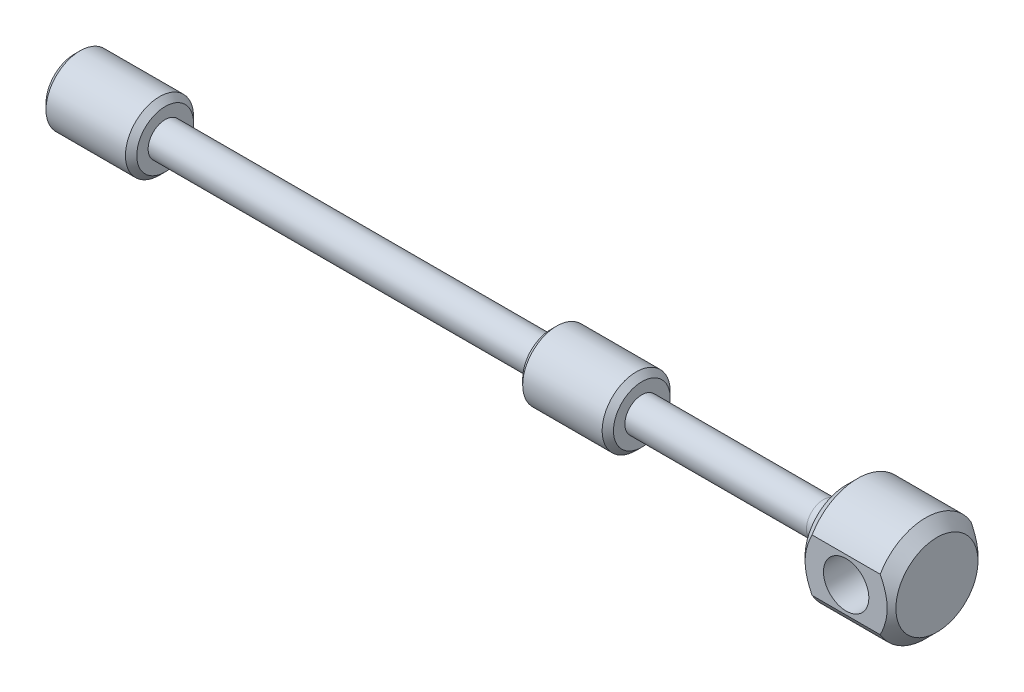
ISO-10303-21;
HEADER;
FILE_DESCRIPTION(('STEP AP214'),'2;1');
FILE_NAME('part.step','',(''),(''),'','','');
FILE_SCHEMA(('AUTOMOTIVE_DESIGN { 1 0 10303 214 1 1 1 1 }'));
ENDSEC;
DATA;
#1=APPLICATION_CONTEXT('core data for automotive mechanical design processes');
#2=APPLICATION_PROTOCOL_DEFINITION('international standard','automotive_design',2000,#1);
#3=PRODUCT_CONTEXT('',#1,'mechanical');
#4=PRODUCT('Part','Part','',(#3));
#5=PRODUCT_RELATED_PRODUCT_CATEGORY('part','',(#4));
#6=PRODUCT_DEFINITION_FORMATION('','',#4);
#7=PRODUCT_DEFINITION_CONTEXT('part definition',#1,'design');
#8=PRODUCT_DEFINITION('design','',#6,#7);
#9=PRODUCT_DEFINITION_SHAPE('','',#8);
#10=(LENGTH_UNIT() NAMED_UNIT(*) SI_UNIT(.MILLI.,.METRE.));
#11=(NAMED_UNIT(*) PLANE_ANGLE_UNIT() SI_UNIT($,.RADIAN.));
#12=(NAMED_UNIT(*) SI_UNIT($,.STERADIAN.) SOLID_ANGLE_UNIT());
#13=UNCERTAINTY_MEASURE_WITH_UNIT(LENGTH_MEASURE(1.E-05),#10,'distance_accuracy_value','');
#14=(GEOMETRIC_REPRESENTATION_CONTEXT(3) GLOBAL_UNCERTAINTY_ASSIGNED_CONTEXT((#13)) GLOBAL_UNIT_ASSIGNED_CONTEXT((#10,
#11,#12)) REPRESENTATION_CONTEXT('',''));
#15=CARTESIAN_POINT('',(0.,0.,0.));
#16=DIRECTION('',(0.,0.,1.));
#17=DIRECTION('',(1.,0.,0.));
#18=AXIS2_PLACEMENT_3D('',#15,#16,#17);
#19=CARTESIAN_POINT('',(30.,0.,0.));
#20=DIRECTION('',(1.,0.,0.));
#21=DIRECTION('',(0.,0.,-1.));
#22=AXIS2_PLACEMENT_3D('',#19,#20,#21);
#23=CYLINDRICAL_SURFACE('',#22,4.61737045275685);
#24=DIRECTION('',(1.,0.,0.));
#25=VECTOR('',#24,1.);
#26=CARTESIAN_POINT('',(30.,-2.30653634222225,4.));
#27=LINE('',#26,#25);
#28=CARTESIAN_POINT('',(31.,-2.30653634222225,4.));
#29=VERTEX_POINT('',#28);
#30=CARTESIAN_POINT('',(37.,-2.30653634222225,4.));
#31=VERTEX_POINT('',#30);
#32=EDGE_CURVE('E98',#29,#31,#27,.T.);
#33=ORIENTED_EDGE('',*,*,#32,.F.);
#34=CARTESIAN_POINT('',(31.,0.,0.));
#35=DIRECTION('',(1.,0.,0.));
#36=DIRECTION('',(0.,0.,-1.));
#37=AXIS2_PLACEMENT_3D('',#34,#35,#36);
#38=CIRCLE('',#37,4.61737045275685);
#39=CARTESIAN_POINT('',(31.,-2.30653634222225,-4.));
#40=VERTEX_POINT('',#39);
#41=EDGE_CURVE('E82',#29,#40,#38,.T.);
#42=ORIENTED_EDGE('',*,*,#41,.T.);
#43=DIRECTION('',(1.,0.,0.));
#44=VECTOR('',#43,1.);
#45=CARTESIAN_POINT('',(30.,-2.30653634222225,-4.));
#46=LINE('',#45,#44);
#47=CARTESIAN_POINT('',(37.,-2.30653634222225,-4.));
#48=VERTEX_POINT('',#47);
#49=EDGE_CURVE('E95',#40,#48,#46,.T.);
#50=ORIENTED_EDGE('',*,*,#49,.T.);
#51=CARTESIAN_POINT('',(37.,0.,0.));
#52=DIRECTION('',(1.,0.,0.));
#53=DIRECTION('',(0.,0.,-1.));
#54=AXIS2_PLACEMENT_3D('',#51,#52,#53);
#55=CIRCLE('',#54,4.61737045275685);
#56=EDGE_CURVE('E99',#48,#31,#55,.F.);
#57=ORIENTED_EDGE('',*,*,#56,.T.);
#58=EDGE_LOOP('',(#33,#42,#50,#57));
#59=FACE_BOUND('',#58,.T.);
#60=ADVANCED_FACE('F33',(#59),#23,.T.);
#61=CARTESIAN_POINT('',(38.,0.,0.));
#62=DIRECTION('',(-1.,0.,0.));
#63=DIRECTION('',(0.,0.,1.));
#64=AXIS2_PLACEMENT_3D('',#61,#62,#63);
#65=CYLINDRICAL_SURFACE('',#64,1.5);
#66=CARTESIAN_POINT('',(28.,0.,0.));
#67=DIRECTION('',(1.,0.,0.));
#68=DIRECTION('',(0.,0.,-1.));
#69=AXIS2_PLACEMENT_3D('',#66,#67,#68);
#70=CIRCLE('',#69,1.5);
#71=CARTESIAN_POINT('',(28.,0.,-1.5));
#72=VERTEX_POINT('',#71);
#73=EDGE_CURVE('E11',#72,#72,#70,.F.);
#74=ORIENTED_EDGE('',*,*,#73,.T.);
#75=EDGE_LOOP('',(#74));
#76=FACE_BOUND('',#75,.T.);
#77=CARTESIAN_POINT('',(12.,0.,0.));
#78=DIRECTION('',(-1.,0.,0.));
#79=DIRECTION('',(0.,0.,1.));
#80=AXIS2_PLACEMENT_3D('',#77,#78,#79);
#81=CIRCLE('',#80,1.5);
#82=CARTESIAN_POINT('',(12.,0.,1.5));
#83=VERTEX_POINT('',#82);
#84=EDGE_CURVE('E119',#83,#83,#81,.T.);
#85=ORIENTED_EDGE('',*,*,#84,.F.);
#86=EDGE_LOOP('',(#85));
#87=FACE_BOUND('',#86,.T.);
#88=ADVANCED_FACE('F215',(#76,#87),#65,.T.);
#89=CARTESIAN_POINT('',(4.,0.,0.));
#90=DIRECTION('',(-1.,0.,0.));
#91=DIRECTION('',(0.,0.,1.));
#92=AXIS2_PLACEMENT_3D('',#89,#90,#91);
#93=CIRCLE('',#92,1.5);
#94=CARTESIAN_POINT('',(4.,0.,1.5));
#95=VERTEX_POINT('',#94);
#96=EDGE_CURVE('E114',#95,#95,#93,.T.);
#97=ORIENTED_EDGE('',*,*,#96,.T.);
#98=EDGE_LOOP('',(#97));
#99=FACE_BOUND('',#98,.T.);
#100=CARTESIAN_POINT('',(-30.,0.,0.));
#101=DIRECTION('',(-1.,0.,0.));
#102=DIRECTION('',(0.,0.,1.));
#103=AXIS2_PLACEMENT_3D('',#100,#101,#102);
#104=CIRCLE('',#103,1.5);
#105=CARTESIAN_POINT('',(-30.,0.,1.5));
#106=VERTEX_POINT('',#105);
#107=EDGE_CURVE('E116',#106,#106,#104,.T.);
#108=ORIENTED_EDGE('',*,*,#107,.F.);
#109=EDGE_LOOP('',(#108));
#110=FACE_BOUND('',#109,.T.);
#111=ADVANCED_FACE('F211',(#99,#110),#65,.T.);
#112=CARTESIAN_POINT('',(-30.,0.,0.));
#113=DIRECTION('',(-1.,0.,0.));
#114=DIRECTION('',(0.,0.,1.));
#115=AXIS2_PLACEMENT_3D('',#112,#113,#114);
#116=CYLINDRICAL_SURFACE('',#115,3.);
#117=CARTESIAN_POINT('',(-37.5,0.,0.));
#118=DIRECTION('',(1.,0.,0.));
#119=DIRECTION('',(0.,0.,-1.));
#120=AXIS2_PLACEMENT_3D('',#117,#118,#119);
#121=CIRCLE('',#120,3.);
#122=CARTESIAN_POINT('',(-37.5,0.,-3.));
#123=VERTEX_POINT('',#122);
#124=EDGE_CURVE('E142',#123,#123,#121,.T.);
#125=ORIENTED_EDGE('',*,*,#124,.T.);
#126=EDGE_LOOP('',(#125));
#127=FACE_BOUND('',#126,.T.);
#128=CARTESIAN_POINT('',(-30.5,0.,0.));
#129=DIRECTION('',(-1.,0.,0.));
#130=DIRECTION('',(0.,0.,1.));
#131=AXIS2_PLACEMENT_3D('',#128,#129,#130);
#132=CIRCLE('',#131,3.);
#133=CARTESIAN_POINT('',(-30.5,0.,3.));
#134=VERTEX_POINT('',#133);
#135=EDGE_CURVE('E139',#134,#134,#132,.T.);
#136=ORIENTED_EDGE('',*,*,#135,.T.);
#137=EDGE_LOOP('',(#136));
#138=FACE_BOUND('',#137,.T.);
#139=ADVANCED_FACE('F214',(#127,#138),#116,.T.);
#140=CARTESIAN_POINT('',(-30.,0.,0.));
#141=DIRECTION('',(-1.,0.,0.));
#142=DIRECTION('',(0.,0.,1.));
#143=AXIS2_PLACEMENT_3D('',#140,#141,#142);
#144=PLANE('',#143);
#145=CARTESIAN_POINT('',(-30.,0.,0.));
#146=DIRECTION('',(-1.,0.,0.));
#147=DIRECTION('',(0.,0.,1.));
#148=AXIS2_PLACEMENT_3D('',#145,#146,#147);
#149=CIRCLE('',#148,2.5);
#150=CARTESIAN_POINT('',(-30.,0.,2.5));
#151=VERTEX_POINT('',#150);
#152=EDGE_CURVE('E145',#151,#151,#149,.F.);
#153=ORIENTED_EDGE('',*,*,#152,.T.);
#154=EDGE_LOOP('',(#153));
#155=FACE_BOUND('',#154,.T.);
#156=ORIENTED_EDGE('',*,*,#107,.T.);
#157=EDGE_LOOP('',(#156));
#158=FACE_BOUND('',#157,.T.);
#159=ADVANCED_FACE('F221',(#155,#158),#144,.F.);
#160=CARTESIAN_POINT('',(-38.,0.,0.));
#161=DIRECTION('',(1.,0.,0.));
#162=DIRECTION('',(0.,0.,-1.));
#163=AXIS2_PLACEMENT_3D('',#160,#161,#162);
#164=PLANE('',#163);
#165=CARTESIAN_POINT('',(-38.,0.,0.));
#166=DIRECTION('',(1.,0.,0.));
#167=DIRECTION('',(0.,0.,-1.));
#168=AXIS2_PLACEMENT_3D('',#165,#166,#167);
#169=CIRCLE('',#168,2.5);
#170=CARTESIAN_POINT('',(-38.,0.,-2.5));
#171=VERTEX_POINT('',#170);
#172=EDGE_CURVE('E136',#171,#171,#169,.F.);
#173=ORIENTED_EDGE('',*,*,#172,.T.);
#174=EDGE_LOOP('',(#173));
#175=FACE_BOUND('',#174,.T.);
#176=ADVANCED_FACE('F217',(#175),#164,.F.);
#177=CARTESIAN_POINT('',(4.,0.,0.));
#178=DIRECTION('',(1.,0.,0.));
#179=DIRECTION('',(0.,0.,-1.));
#180=AXIS2_PLACEMENT_3D('',#177,#178,#179);
#181=CYLINDRICAL_SURFACE('',#180,3.);
#182=CARTESIAN_POINT('',(11.5,0.,0.));
#183=DIRECTION('',(-1.,0.,0.));
#184=DIRECTION('',(0.,0.,1.));
#185=AXIS2_PLACEMENT_3D('',#182,#183,#184);
#186=CIRCLE('',#185,3.);
#187=CARTESIAN_POINT('',(11.5,0.,3.));
#188=VERTEX_POINT('',#187);
#189=EDGE_CURVE('E127',#188,#188,#186,.T.);
#190=ORIENTED_EDGE('',*,*,#189,.T.);
#191=EDGE_LOOP('',(#190));
#192=FACE_BOUND('',#191,.T.);
#193=CARTESIAN_POINT('',(4.50000000000001,0.,0.));
#194=DIRECTION('',(-1.,0.,0.));
#195=DIRECTION('',(0.,0.,1.));
#196=AXIS2_PLACEMENT_3D('',#193,#194,#195);
#197=CIRCLE('',#196,3.);
#198=CARTESIAN_POINT('',(4.50000000000001,0.,3.));
#199=VERTEX_POINT('',#198);
#200=EDGE_CURVE('E122',#199,#199,#197,.F.);
#201=ORIENTED_EDGE('',*,*,#200,.T.);
#202=EDGE_LOOP('',(#201));
#203=FACE_BOUND('',#202,.T.);
#204=ADVANCED_FACE('F220',(#192,#203),#181,.T.);
#205=CARTESIAN_POINT('',(4.,0.,0.));
#206=DIRECTION('',(-1.,0.,0.));
#207=DIRECTION('',(0.,0.,1.));
#208=AXIS2_PLACEMENT_3D('',#205,#206,#207);
#209=PLANE('',#208);
#210=CARTESIAN_POINT('',(4.,0.,0.));
#211=DIRECTION('',(-1.,0.,0.));
#212=DIRECTION('',(0.,0.,1.));
#213=AXIS2_PLACEMENT_3D('',#210,#211,#212);
#214=CIRCLE('',#213,2.5);
#215=CARTESIAN_POINT('',(4.,0.,2.5));
#216=VERTEX_POINT('',#215);
#217=EDGE_CURVE('E133',#216,#216,#214,.T.);
#218=ORIENTED_EDGE('',*,*,#217,.T.);
#219=EDGE_LOOP('',(#218));
#220=FACE_BOUND('',#219,.T.);
#221=ORIENTED_EDGE('',*,*,#96,.F.);
#222=EDGE_LOOP('',(#221));
#223=FACE_BOUND('',#222,.T.);
#224=ADVANCED_FACE('F234',(#220,#223),#209,.T.);
#225=CARTESIAN_POINT('',(12.,0.,0.));
#226=DIRECTION('',(-1.,0.,0.));
#227=DIRECTION('',(0.,0.,1.));
#228=AXIS2_PLACEMENT_3D('',#225,#226,#227);
#229=PLANE('',#228);
#230=CARTESIAN_POINT('',(12.,0.,0.));
#231=DIRECTION('',(-1.,0.,0.));
#232=DIRECTION('',(0.,0.,1.));
#233=AXIS2_PLACEMENT_3D('',#230,#231,#232);
#234=CIRCLE('',#233,2.50000000000001);
#235=CARTESIAN_POINT('',(12.,0.,2.50000000000001));
#236=VERTEX_POINT('',#235);
#237=EDGE_CURVE('E130',#236,#236,#234,.F.);
#238=ORIENTED_EDGE('',*,*,#237,.T.);
#239=EDGE_LOOP('',(#238));
#240=FACE_BOUND('',#239,.T.);
#241=ORIENTED_EDGE('',*,*,#84,.T.);
#242=EDGE_LOOP('',(#241));
#243=FACE_BOUND('',#242,.T.);
#244=ADVANCED_FACE('F209',(#240,#243),#229,.F.);
#245=CARTESIAN_POINT('',(11.5,0.,0.));
#246=DIRECTION('',(-1.,0.,0.));
#247=DIRECTION('',(0.,0.,1.));
#248=AXIS2_PLACEMENT_3D('',#245,#246,#247);
#249=CONICAL_SURFACE('',#248,3.,0.785398163397453);
#250=ORIENTED_EDGE('',*,*,#237,.F.);
#251=EDGE_LOOP('',(#250));
#252=FACE_BOUND('',#251,.T.);
#253=ORIENTED_EDGE('',*,*,#189,.F.);
#254=EDGE_LOOP('',(#253));
#255=FACE_BOUND('',#254,.T.);
#256=ADVANCED_FACE('F205',(#252,#255),#249,.T.);
#257=CARTESIAN_POINT('',(4.,0.,0.));
#258=DIRECTION('',(1.,0.,0.));
#259=DIRECTION('',(0.,0.,-1.));
#260=AXIS2_PLACEMENT_3D('',#257,#258,#259);
#261=CONICAL_SURFACE('',#260,2.5,0.785398163397444);
#262=ORIENTED_EDGE('',*,*,#200,.F.);
#263=EDGE_LOOP('',(#262));
#264=FACE_BOUND('',#263,.T.);
#265=ORIENTED_EDGE('',*,*,#217,.F.);
#266=EDGE_LOOP('',(#265));
#267=FACE_BOUND('',#266,.T.);
#268=ADVANCED_FACE('F201',(#264,#267),#261,.T.);
#269=CARTESIAN_POINT('',(-38.,0.,0.));
#270=DIRECTION('',(1.,0.,0.));
#271=DIRECTION('',(0.,0.,-1.));
#272=AXIS2_PLACEMENT_3D('',#269,#270,#271);
#273=CONICAL_SURFACE('',#272,2.5,0.785398163397446);
#274=ORIENTED_EDGE('',*,*,#124,.F.);
#275=EDGE_LOOP('',(#274));
#276=FACE_BOUND('',#275,.T.);
#277=ORIENTED_EDGE('',*,*,#172,.F.);
#278=EDGE_LOOP('',(#277));
#279=FACE_BOUND('',#278,.T.);
#280=ADVANCED_FACE('F197',(#276,#279),#273,.T.);
#281=CARTESIAN_POINT('',(-30.5,0.,0.));
#282=DIRECTION('',(-1.,0.,0.));
#283=DIRECTION('',(0.,0.,1.));
#284=AXIS2_PLACEMENT_3D('',#281,#282,#283);
#285=CONICAL_SURFACE('',#284,3.,0.785398163397453);
#286=ORIENTED_EDGE('',*,*,#152,.F.);
#287=EDGE_LOOP('',(#286));
#288=FACE_BOUND('',#287,.T.);
#289=ORIENTED_EDGE('',*,*,#135,.F.);
#290=EDGE_LOOP('',(#289));
#291=FACE_BOUND('',#290,.T.);
#292=ADVANCED_FACE('F192',(#288,#291),#285,.T.);
#293=DIRECTION('',(1.,0.,0.));
#294=VECTOR('',#293,1.);
#295=CARTESIAN_POINT('',(30.,2.30653634222225,-4.));
#296=LINE('',#295,#294);
#297=CARTESIAN_POINT('',(31.,2.30653634222225,-4.));
#298=VERTEX_POINT('',#297);
#299=CARTESIAN_POINT('',(37.,2.30653634222225,-4.));
#300=VERTEX_POINT('',#299);
#301=EDGE_CURVE('E103',#298,#300,#296,.T.);
#302=ORIENTED_EDGE('',*,*,#301,.F.);
#303=CARTESIAN_POINT('',(31.,0.,0.));
#304=DIRECTION('',(1.,0.,0.));
#305=DIRECTION('',(0.,0.,-1.));
#306=AXIS2_PLACEMENT_3D('',#303,#304,#305);
#307=CIRCLE('',#306,4.61737045275685);
#308=CARTESIAN_POINT('',(31.,2.30653634222225,4.));
#309=VERTEX_POINT('',#308);
#310=EDGE_CURVE('E83',#298,#309,#307,.T.);
#311=ORIENTED_EDGE('',*,*,#310,.T.);
#312=DIRECTION('',(1.,0.,0.));
#313=VECTOR('',#312,1.);
#314=CARTESIAN_POINT('',(30.,2.30653634222225,4.));
#315=LINE('',#314,#313);
#316=CARTESIAN_POINT('',(37.,2.30653634222225,4.));
#317=VERTEX_POINT('',#316);
#318=EDGE_CURVE('E105',#309,#317,#315,.T.);
#319=ORIENTED_EDGE('',*,*,#318,.T.);
#320=CARTESIAN_POINT('',(37.,0.,0.));
#321=DIRECTION('',(-1.,0.,0.));
#322=DIRECTION('',(0.,0.,1.));
#323=AXIS2_PLACEMENT_3D('',#320,#321,#322);
#324=CIRCLE('',#323,4.61737045275685);
#325=EDGE_CURVE('E88',#317,#300,#324,.T.);
#326=ORIENTED_EDGE('',*,*,#325,.T.);
#327=EDGE_LOOP('',(#302,#311,#319,#326));
#328=FACE_BOUND('',#327,.T.);
#329=ADVANCED_FACE('F196',(#328),#23,.T.);
#330=CARTESIAN_POINT('',(30.,0.,0.));
#331=DIRECTION('',(1.,0.,0.));
#332=DIRECTION('',(0.,0.,-1.));
#333=AXIS2_PLACEMENT_3D('',#330,#331,#332);
#334=PLANE('',#333);
#335=CARTESIAN_POINT('',(30.,0.,0.));
#336=DIRECTION('',(1.,0.,0.));
#337=DIRECTION('',(0.,0.,-1.));
#338=AXIS2_PLACEMENT_3D('',#335,#336,#337);
#339=CIRCLE('',#338,3.5);
#340=CARTESIAN_POINT('',(30.,0.,-3.5));
#341=VERTEX_POINT('',#340);
#342=EDGE_CURVE('E41',#341,#341,#339,.T.);
#343=ORIENTED_EDGE('',*,*,#342,.T.);
#344=EDGE_LOOP('',(#343));
#345=FACE_BOUND('',#344,.T.);
#346=CARTESIAN_POINT('',(30.,0.,0.));
#347=DIRECTION('',(1.,0.,0.));
#348=DIRECTION('',(0.,0.,-1.));
#349=AXIS2_PLACEMENT_3D('',#346,#347,#348);
#350=CIRCLE('',#349,3.61737045275683);
#351=CARTESIAN_POINT('',(30.,-1.80700173354792,3.13370606908704));
#352=VERTEX_POINT('',#351);
#353=EDGE_CURVE('E51',#352,#352,#350,.F.);
#354=ORIENTED_EDGE('',*,*,#353,.T.);
#355=EDGE_LOOP('',(#354));
#356=FACE_BOUND('',#355,.T.);
#357=ADVANCED_FACE('F173',(#345,#356),#334,.F.);
#358=CARTESIAN_POINT('',(38.,0.,0.));
#359=DIRECTION('',(1.,0.,0.));
#360=DIRECTION('',(0.,0.,-1.));
#361=AXIS2_PLACEMENT_3D('',#358,#359,#360);
#362=PLANE('',#361);
#363=CARTESIAN_POINT('',(38.,0.,0.));
#364=DIRECTION('',(1.,0.,0.));
#365=DIRECTION('',(0.,0.,-1.));
#366=AXIS2_PLACEMENT_3D('',#363,#364,#365);
#367=CIRCLE('',#366,3.61737045275685);
#368=CARTESIAN_POINT('',(38.,-1.80700173354794,3.13370606908706));
#369=VERTEX_POINT('',#368);
#370=EDGE_CURVE('E46',#369,#369,#367,.T.);
#371=ORIENTED_EDGE('',*,*,#370,.T.);
#372=EDGE_LOOP('',(#371));
#373=FACE_BOUND('',#372,.T.);
#374=ADVANCED_FACE('F171',(#373),#362,.T.);
#375=CARTESIAN_POINT('',(30.,2.30653634222225,4.));
#376=DIRECTION('',(0.,0.,-1.));
#377=DIRECTION('',(-1.,0.,0.));
#378=AXIS2_PLACEMENT_3D('',#375,#376,#377);
#379=PLANE('',#378);
#380=CARTESIAN_POINT('',(34.,0.,4.));
#381=DIRECTION('',(0.,0.,1.));
#382=DIRECTION('',(1.,0.,0.));
#383=AXIS2_PLACEMENT_3D('',#380,#381,#382);
#384=CIRCLE('',#383,2.);
#385=CARTESIAN_POINT('',(36.,0.,4.));
#386=VERTEX_POINT('',#385);
#387=EDGE_CURVE('E110',#386,#386,#384,.T.);
#388=ORIENTED_EDGE('',*,*,#387,.F.);
#389=EDGE_LOOP('',(#388));
#390=FACE_BOUND('',#389,.T.);
#391=ORIENTED_EDGE('',*,*,#318,.F.);
#392=CARTESIAN_POINT('',(31.,2.30653634222225,4.));
#393=CARTESIAN_POINT('',(30.9601974597438,2.22684266093385,4.));
#394=CARTESIAN_POINT('',(30.9216231431797,2.14653696816026,4.));
#395=CARTESIAN_POINT('',(30.8473064089955,1.98457447196258,4.));
#396=CARTESIAN_POINT('',(30.8115655703819,1.9029169454187,4.));
#397=CARTESIAN_POINT('',(30.7088575437757,1.65498056887095,4.));
#398=CARTESIAN_POINT('',(30.6468383548584,1.48658671679935,4.));
#399=CARTESIAN_POINT('',(30.5412607989887,1.14860833810381,4.));
#400=CARTESIAN_POINT('',(30.4972814479607,0.979157717006152,4.));
#401=CARTESIAN_POINT('',(30.4295038036427,0.636549566748635,4.));
#402=CARTESIAN_POINT('',(30.4056556592604,0.46340228944076,4.));
#403=CARTESIAN_POINT('',(30.3840669183017,0.164574112776573,4.));
#404=CARTESIAN_POINT('',(30.3808617336459,0.0392721423522474,4.));
#405=CARTESIAN_POINT('',(30.3862430683893,-0.211128815166595,4.));
#406=CARTESIAN_POINT('',(30.3948336776276,-0.336227716794167,4.));
#407=CARTESIAN_POINT('',(30.4233923902341,-0.58587740230277,4.));
#408=CARTESIAN_POINT('',(30.4434302000968,-0.710420072627269,4.));
#409=CARTESIAN_POINT('',(30.4938204507105,-0.957346696288617,4.));
#410=CARTESIAN_POINT('',(30.5241717494015,-1.07973088706612,4.));
#411=CARTESIAN_POINT('',(30.6126932465116,-1.38760538730253,4.));
#412=CARTESIAN_POINT('',(30.677023282784,-1.57132135717105,4.));
#413=CARTESIAN_POINT('',(30.8218782374388,-1.9324637971529,4.));
#414=CARTESIAN_POINT('',(30.9024340363439,-2.10987750387023,4.));
#415=CARTESIAN_POINT('',(31.0747286228758,-2.45730641506917,4.));
#416=CARTESIAN_POINT('',(31.1663702829186,-2.62737036174245,4.));
#417=CARTESIAN_POINT('',(31.3100988256545,-2.87829920478718,4.));
#418=CARTESIAN_POINT('',(31.3589325667636,-2.96106101409465,4.));
#419=CARTESIAN_POINT('',(31.4584593076874,-3.12543004683318,4.));
#420=CARTESIAN_POINT('',(31.5091518061041,-3.20703757351878,4.));
#421=CARTESIAN_POINT('',(31.5606453298821,-3.28813738235769,4.));
#422=B_SPLINE_CURVE_WITH_KNOTS('',3,(#392,#393,#394,#395,#396,#397,#398,#399,#400,#401,#402,
#403,#404,#405,#406,#407,#408,#409,#410,#411,#412,#413,#414,#415,#416,#417,#418,#419,#420,#421),
.UNSPECIFIED.,.F.,.F.,(4,2,2,2,2,2,2,2,2,2,2,2,2,2,4),(0.,0.267220652181242,0.534589186154761,
1.07217853167009,1.59639022074266,2.11929995944174,2.49480039424982,2.87043105549436,
3.24837383892696,3.62627478464406,4.20913804617866,4.79312126389391,5.37231532862606,
5.66058208284876,5.94877164134548),.UNSPECIFIED.);
#423=EDGE_CURVE('E183',#309,#29,#422,.T.);
#424=ORIENTED_EDGE('',*,*,#423,.T.);
#425=ORIENTED_EDGE('',*,*,#32,.T.);
#426=CARTESIAN_POINT('',(37.,-2.30653634222225,4.));
#427=CARTESIAN_POINT('',(37.0398025402563,-2.22684266093386,4.));
#428=CARTESIAN_POINT('',(37.0783768568203,-2.14653696816026,4.));
#429=CARTESIAN_POINT('',(37.1526935910045,-1.98457447196258,4.));
#430=CARTESIAN_POINT('',(37.1884344296181,-1.90291694541871,4.));
#431=CARTESIAN_POINT('',(37.2911424562243,-1.65498056887096,4.));
#432=CARTESIAN_POINT('',(37.3531616451416,-1.48658671679936,4.));
#433=CARTESIAN_POINT('',(37.4587392010113,-1.14860833810381,4.));
#434=CARTESIAN_POINT('',(37.5027185520393,-0.979157717006157,4.));
#435=CARTESIAN_POINT('',(37.5704961963573,-0.63654956674864,4.));
#436=CARTESIAN_POINT('',(37.5943443407397,-0.463402289440766,4.));
#437=CARTESIAN_POINT('',(37.6159330816983,-0.164574112776578,4.));
#438=CARTESIAN_POINT('',(37.6191382663542,-0.0392721423522532,4.));
#439=CARTESIAN_POINT('',(37.6137569316108,0.211128815166589,4.));
#440=CARTESIAN_POINT('',(37.6051663223725,0.336227716794161,4.));
#441=CARTESIAN_POINT('',(37.5766076097659,0.585877402302764,4.));
#442=CARTESIAN_POINT('',(37.5565697999032,0.710420072627263,4.));
#443=CARTESIAN_POINT('',(37.5061795492895,0.957346696288611,4.));
#444=CARTESIAN_POINT('',(37.4758282505986,1.07973088706612,4.));
#445=CARTESIAN_POINT('',(37.3873067534884,1.38760538730252,4.));
#446=CARTESIAN_POINT('',(37.322976717216,1.57132135717104,4.));
#447=CARTESIAN_POINT('',(37.1781217625613,1.93246379715289,4.));
#448=CARTESIAN_POINT('',(37.0975659636562,2.10987750387022,4.));
#449=CARTESIAN_POINT('',(36.9252713771242,2.45730641506916,4.));
#450=CARTESIAN_POINT('',(36.8336297170815,2.62737036174244,4.));
#451=CARTESIAN_POINT('',(36.6899011743455,2.87829920478717,4.));
#452=CARTESIAN_POINT('',(36.6410674332364,2.96106101409464,4.));
#453=CARTESIAN_POINT('',(36.5415406923127,3.12543004683317,4.));
#454=CARTESIAN_POINT('',(36.4908481938959,3.20703757351877,4.));
#455=CARTESIAN_POINT('',(36.4393546701179,3.28813738235767,4.));
#456=B_SPLINE_CURVE_WITH_KNOTS('',3,(#426,#427,#428,#429,#430,#431,#432,#433,#434,#435,#436,
#437,#438,#439,#440,#441,#442,#443,#444,#445,#446,#447,#448,#449,#450,#451,#452,#453,#454,#455),
.UNSPECIFIED.,.F.,.F.,(4,2,2,2,2,2,2,2,2,2,2,2,2,2,4),(0.,0.267220652181238,0.534589186154758,
1.07217853167008,1.59639022074266,2.11929995944173,2.49480039424982,2.87043105549435,
3.24837383892696,3.62627478464405,4.20913804617865,4.7931212638939,5.37231532862604,
5.66058208284875,5.94877164134547),.UNSPECIFIED.);
#457=EDGE_CURVE('E177',#31,#317,#456,.T.);
#458=ORIENTED_EDGE('',*,*,#457,.T.);
#459=EDGE_LOOP('',(#391,#424,#425,#458));
#460=FACE_BOUND('',#459,.T.);
#461=ADVANCED_FACE('F165',(#390,#460),#379,.F.);
#462=CARTESIAN_POINT('',(30.,2.30653634222225,-4.));
#463=DIRECTION('',(0.,0.,1.));
#464=DIRECTION('',(1.,0.,0.));
#465=AXIS2_PLACEMENT_3D('',#462,#463,#464);
#466=PLANE('',#465);
#467=CARTESIAN_POINT('',(34.,0.,-4.));
#468=DIRECTION('',(0.,0.,1.));
#469=DIRECTION('',(1.,0.,0.));
#470=AXIS2_PLACEMENT_3D('',#467,#468,#469);
#471=CIRCLE('',#470,2.);
#472=CARTESIAN_POINT('',(36.,0.,-4.));
#473=VERTEX_POINT('',#472);
#474=EDGE_CURVE('E107',#473,#473,#471,.T.);
#475=ORIENTED_EDGE('',*,*,#474,.T.);
#476=EDGE_LOOP('',(#475));
#477=FACE_BOUND('',#476,.T.);
#478=ORIENTED_EDGE('',*,*,#49,.F.);
#479=CARTESIAN_POINT('',(31.,-2.30653634222225,-4.));
#480=CARTESIAN_POINT('',(30.9601974597438,-2.22684266093385,-4.));
#481=CARTESIAN_POINT('',(30.9216231431797,-2.14653696816026,-4.));
#482=CARTESIAN_POINT('',(30.8473064089955,-1.98457447196258,-4.));
#483=CARTESIAN_POINT('',(30.8115655703819,-1.9029169454187,-4.));
#484=CARTESIAN_POINT('',(30.7088575437757,-1.65498056887095,-4.));
#485=CARTESIAN_POINT('',(30.6468383548584,-1.48658671679935,-4.));
#486=CARTESIAN_POINT('',(30.5412607989887,-1.14860833810381,-4.));
#487=CARTESIAN_POINT('',(30.4972814479607,-0.979157717006151,-4.));
#488=CARTESIAN_POINT('',(30.4295038036427,-0.636549566748634,-4.));
#489=CARTESIAN_POINT('',(30.4056556592604,-0.46340228944076,-4.));
#490=CARTESIAN_POINT('',(30.3840669183017,-0.164574112776573,-4.));
#491=CARTESIAN_POINT('',(30.3808617336459,-0.0392721423522473,-4.));
#492=CARTESIAN_POINT('',(30.3862430683893,0.211128815166595,-4.));
#493=CARTESIAN_POINT('',(30.3948336776276,0.336227716794167,-4.));
#494=CARTESIAN_POINT('',(30.4233923902341,0.585877402302771,-4.));
#495=CARTESIAN_POINT('',(30.4434302000968,0.710420072627269,-4.));
#496=CARTESIAN_POINT('',(30.4938204507105,0.957346696288618,-4.));
#497=CARTESIAN_POINT('',(30.5241717494015,1.07973088706613,-4.));
#498=CARTESIAN_POINT('',(30.6126932465116,1.38760538730253,-4.));
#499=CARTESIAN_POINT('',(30.677023282784,1.57132135717105,-4.));
#500=CARTESIAN_POINT('',(30.8218782374388,1.9324637971529,-4.));
#501=CARTESIAN_POINT('',(30.9024340363439,2.10987750387023,-4.));
#502=CARTESIAN_POINT('',(31.0747286228758,2.45730641506918,-4.));
#503=CARTESIAN_POINT('',(31.1663702829186,2.62737036174245,-4.));
#504=CARTESIAN_POINT('',(31.3100988256545,2.87829920478718,-4.));
#505=CARTESIAN_POINT('',(31.3589325667636,2.96106101409465,-4.));
#506=CARTESIAN_POINT('',(31.4584593076874,3.12543004683318,-4.));
#507=CARTESIAN_POINT('',(31.5091518061041,3.20703757351878,-4.));
#508=CARTESIAN_POINT('',(31.5606453298821,3.28813738235769,-4.));
#509=B_SPLINE_CURVE_WITH_KNOTS('',3,(#479,#480,#481,#482,#483,#484,#485,#486,#487,#488,#489,
#490,#491,#492,#493,#494,#495,#496,#497,#498,#499,#500,#501,#502,#503,#504,#505,#506,#507,#508),
.UNSPECIFIED.,.F.,.F.,(4,2,2,2,2,2,2,2,2,2,2,2,2,2,4),(0.,0.267220652181242,0.534589186154761,
1.07217853167009,1.59639022074266,2.11929995944174,2.49480039424982,2.87043105549435,
3.24837383892696,3.62627478464406,4.20913804617866,4.79312126389391,5.37231532862606,
5.66058208284876,5.94877164134548),.UNSPECIFIED.);
#510=EDGE_CURVE('E78',#40,#298,#509,.T.);
#511=ORIENTED_EDGE('',*,*,#510,.T.);
#512=ORIENTED_EDGE('',*,*,#301,.T.);
#513=CARTESIAN_POINT('',(37.,2.30653634222225,-4.));
#514=CARTESIAN_POINT('',(37.0398025402563,2.22684266093385,-4.));
#515=CARTESIAN_POINT('',(37.0783768568203,2.14653696816026,-4.));
#516=CARTESIAN_POINT('',(37.1526935910045,1.98457447196258,-4.));
#517=CARTESIAN_POINT('',(37.1884344296181,1.90291694541871,-4.));
#518=CARTESIAN_POINT('',(37.2911424562243,1.65498056887096,-4.));
#519=CARTESIAN_POINT('',(37.3531616451416,1.48658671679936,-4.));
#520=CARTESIAN_POINT('',(37.4587392010113,1.14860833810381,-4.));
#521=CARTESIAN_POINT('',(37.5027185520393,0.979157717006156,-4.));
#522=CARTESIAN_POINT('',(37.5704961963573,0.63654956674864,-4.));
#523=CARTESIAN_POINT('',(37.5943443407397,0.463402289440765,-4.));
#524=CARTESIAN_POINT('',(37.6159330816983,0.164574112776578,-4.));
#525=CARTESIAN_POINT('',(37.6191382663542,0.0392721423522526,-4.));
#526=CARTESIAN_POINT('',(37.6137569316108,-0.211128815166589,-4.));
#527=CARTESIAN_POINT('',(37.6051663223725,-0.336227716794162,-4.));
#528=CARTESIAN_POINT('',(37.5766076097659,-0.585877402302765,-4.));
#529=CARTESIAN_POINT('',(37.5565697999032,-0.710420072627264,-4.));
#530=CARTESIAN_POINT('',(37.5061795492895,-0.957346696288612,-4.));
#531=CARTESIAN_POINT('',(37.4758282505986,-1.07973088706612,-4.));
#532=CARTESIAN_POINT('',(37.3873067534884,-1.38760538730252,-4.));
#533=CARTESIAN_POINT('',(37.322976717216,-1.57132135717104,-4.));
#534=CARTESIAN_POINT('',(37.1781217625613,-1.93246379715289,-4.));
#535=CARTESIAN_POINT('',(37.0975659636562,-2.10987750387022,-4.));
#536=CARTESIAN_POINT('',(36.9252713771242,-2.45730641506916,-4.));
#537=CARTESIAN_POINT('',(36.8336297170815,-2.62737036174244,-4.));
#538=CARTESIAN_POINT('',(36.6899011743455,-2.87829920478716,-4.));
#539=CARTESIAN_POINT('',(36.6410674332364,-2.96106101409464,-4.));
#540=CARTESIAN_POINT('',(36.5415406923127,-3.12543004683317,-4.));
#541=CARTESIAN_POINT('',(36.4908481938959,-3.20703757351877,-4.));
#542=CARTESIAN_POINT('',(36.4393546701179,-3.28813738235767,-4.));
#543=B_SPLINE_CURVE_WITH_KNOTS('',3,(#513,#514,#515,#516,#517,#518,#519,#520,#521,#522,#523,
#524,#525,#526,#527,#528,#529,#530,#531,#532,#533,#534,#535,#536,#537,#538,#539,#540,#541,#542),
.UNSPECIFIED.,.F.,.F.,(4,2,2,2,2,2,2,2,2,2,2,2,2,2,4),(0.,0.267220652181237,0.534589186154758,
1.07217853167008,1.59639022074265,2.11929995944173,2.49480039424982,2.87043105549435,
3.24837383892696,3.62627478464405,4.20913804617864,4.79312126389389,5.37231532862603,
5.66058208284874,5.94877164134547),.UNSPECIFIED.);
#544=EDGE_CURVE('E89',#300,#48,#543,.T.);
#545=ORIENTED_EDGE('',*,*,#544,.T.);
#546=EDGE_LOOP('',(#478,#511,#512,#545));
#547=FACE_BOUND('',#546,.T.);
#548=ADVANCED_FACE('F101',(#477,#547),#466,.F.);
#549=CARTESIAN_POINT('',(34.,0.,-4.));
#550=DIRECTION('',(0.,0.,1.));
#551=DIRECTION('',(1.,0.,0.));
#552=AXIS2_PLACEMENT_3D('',#549,#550,#551);
#553=CYLINDRICAL_SURFACE('',#552,2.);
#554=ORIENTED_EDGE('',*,*,#474,.F.);
#555=EDGE_LOOP('',(#554));
#556=FACE_BOUND('',#555,.T.);
#557=ORIENTED_EDGE('',*,*,#387,.T.);
#558=EDGE_LOOP('',(#557));
#559=FACE_BOUND('',#558,.T.);
#560=ADVANCED_FACE('F164',(#556,#559),#553,.F.);
#561=CARTESIAN_POINT('',(31.,0.,0.));
#562=DIRECTION('',(1.,0.,0.));
#563=DIRECTION('',(0.,0.,-1.));
#564=AXIS2_PLACEMENT_3D('',#561,#562,#563);
#565=CONICAL_SURFACE('',#564,4.61737045275685,0.785398163397449);
#566=ORIENTED_EDGE('',*,*,#353,.F.);
#567=EDGE_LOOP('',(#566));
#568=FACE_BOUND('',#567,.T.);
#569=ORIENTED_EDGE('',*,*,#510,.F.);
#570=ORIENTED_EDGE('',*,*,#41,.F.);
#571=ORIENTED_EDGE('',*,*,#423,.F.);
#572=ORIENTED_EDGE('',*,*,#310,.F.);
#573=EDGE_LOOP('',(#569,#570,#571,#572));
#574=FACE_BOUND('',#573,.T.);
#575=ADVANCED_FACE('F80',(#568,#574),#565,.T.);
#576=CARTESIAN_POINT('',(38.,0.,0.));
#577=DIRECTION('',(-1.,0.,0.));
#578=DIRECTION('',(0.,0.,1.));
#579=AXIS2_PLACEMENT_3D('',#576,#577,#578);
#580=CONICAL_SURFACE('',#579,3.61737045275685,0.785398163397448);
#581=ORIENTED_EDGE('',*,*,#457,.F.);
#582=ORIENTED_EDGE('',*,*,#56,.F.);
#583=ORIENTED_EDGE('',*,*,#544,.F.);
#584=ORIENTED_EDGE('',*,*,#325,.F.);
#585=EDGE_LOOP('',(#581,#582,#583,#584));
#586=FACE_BOUND('',#585,.T.);
#587=ORIENTED_EDGE('',*,*,#370,.F.);
#588=EDGE_LOOP('',(#587));
#589=FACE_BOUND('',#588,.T.);
#590=ADVANCED_FACE('F158',(#586,#589),#580,.T.);
#591=CARTESIAN_POINT('',(28.,0.,0.));
#592=DIRECTION('',(1.,0.,0.));
#593=DIRECTION('',(0.,0.,-1.));
#594=AXIS2_PLACEMENT_3D('',#591,#592,#593);
#595=TOROIDAL_SURFACE('',#594,3.5,2.);
#596=ORIENTED_EDGE('',*,*,#73,.F.);
#597=EDGE_LOOP('',(#596));
#598=FACE_BOUND('',#597,.T.);
#599=ORIENTED_EDGE('',*,*,#342,.F.);
#600=EDGE_LOOP('',(#599));
#601=FACE_BOUND('',#600,.T.);
#602=ADVANCED_FACE('F35',(#598,#601),#595,.F.);
#603=CLOSED_SHELL('',(#60,#88,#111,#139,#159,#176,#204,#224,#244,#256,#268,#280,#292,#329,#357,
#374,#461,#548,#560,#575,#590,#602));
#604=MANIFOLD_SOLID_BREP('B2',#603);
#605=ADVANCED_BREP_SHAPE_REPRESENTATION('',(#18,#604),#14);
#606=SHAPE_DEFINITION_REPRESENTATION(#9,#605);
ENDSEC;
END-ISO-10303-21;
